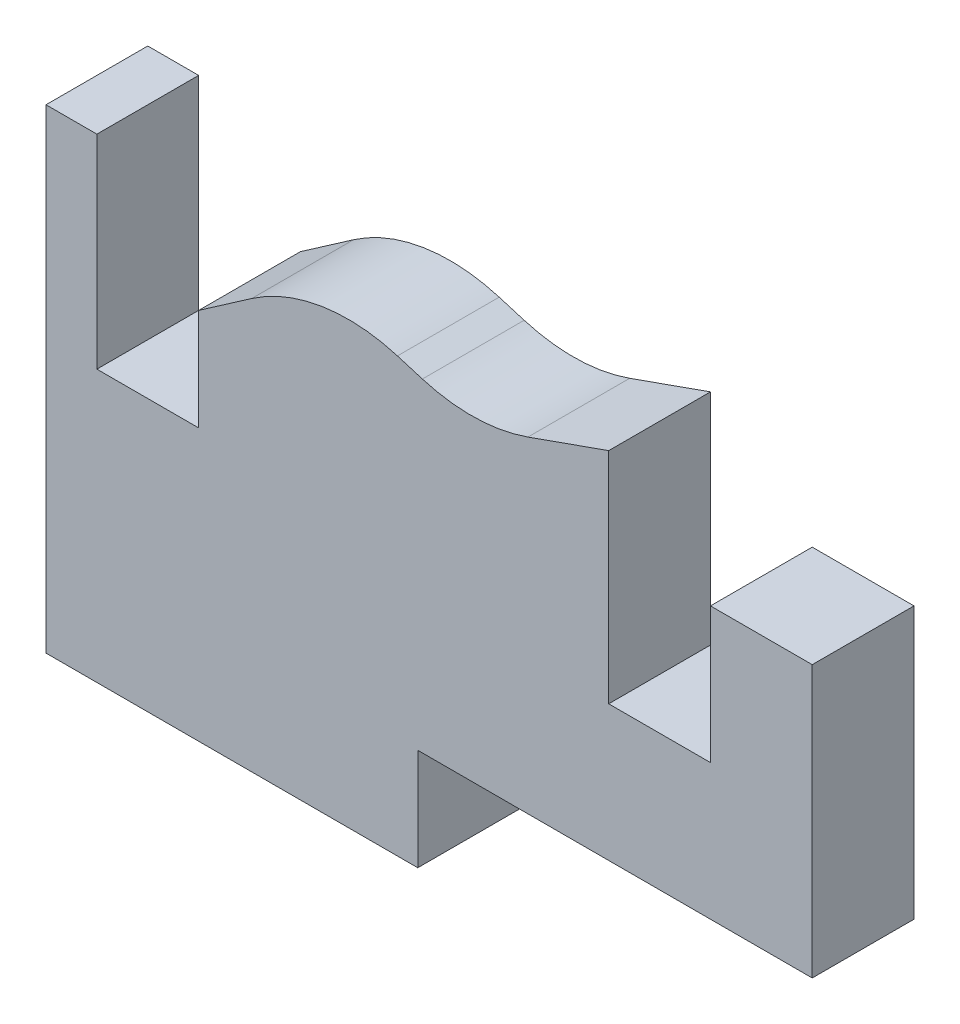
ISO-10303-21;
HEADER;
FILE_DESCRIPTION(('STEP AP214'),'2;1');
FILE_NAME('part.step','',(''),(''),'','','');
FILE_SCHEMA(('AUTOMOTIVE_DESIGN { 1 0 10303 214 1 1 1 1 }'));
ENDSEC;
DATA;
#1=APPLICATION_CONTEXT('core data for automotive mechanical design processes');
#2=APPLICATION_PROTOCOL_DEFINITION('international standard','automotive_design',2000,#1);
#3=PRODUCT_CONTEXT('',#1,'mechanical');
#4=PRODUCT('Part','Part','',(#3));
#5=PRODUCT_RELATED_PRODUCT_CATEGORY('part','',(#4));
#6=PRODUCT_DEFINITION_FORMATION('','',#4);
#7=PRODUCT_DEFINITION_CONTEXT('part definition',#1,'design');
#8=PRODUCT_DEFINITION('design','',#6,#7);
#9=PRODUCT_DEFINITION_SHAPE('','',#8);
#10=(LENGTH_UNIT() NAMED_UNIT(*) SI_UNIT(.MILLI.,.METRE.));
#11=(NAMED_UNIT(*) PLANE_ANGLE_UNIT() SI_UNIT($,.RADIAN.));
#12=(NAMED_UNIT(*) SI_UNIT($,.STERADIAN.) SOLID_ANGLE_UNIT());
#13=UNCERTAINTY_MEASURE_WITH_UNIT(LENGTH_MEASURE(1.E-05),#10,'distance_accuracy_value','');
#14=(GEOMETRIC_REPRESENTATION_CONTEXT(3) GLOBAL_UNCERTAINTY_ASSIGNED_CONTEXT((#13)) GLOBAL_UNIT_ASSIGNED_CONTEXT((#10,
#11,#12)) REPRESENTATION_CONTEXT('',''));
#15=CARTESIAN_POINT('',(0.,0.,0.));
#16=DIRECTION('',(0.,0.,1.));
#17=DIRECTION('',(1.,0.,0.));
#18=AXIS2_PLACEMENT_3D('',#15,#16,#17);
#19=CARTESIAN_POINT('',(-18.6877025722781,-9.27080407187214,6.));
#20=DIRECTION('',(1.,0.,0.));
#21=DIRECTION('',(0.,0.,-1.));
#22=AXIS2_PLACEMENT_3D('',#19,#20,#21);
#23=PLANE('',#22);
#24=DIRECTION('',(0.,-1.,0.));
#25=VECTOR('',#24,1.);
#26=CARTESIAN_POINT('',(-18.6877025722781,-9.27080407187214,0.));
#27=LINE('',#26,#25);
#28=CARTESIAN_POINT('',(-18.6877025722781,18.7291959281279,0.));
#29=VERTEX_POINT('',#28);
#30=CARTESIAN_POINT('',(-18.6877025722781,-9.27080407187214,0.));
#31=VERTEX_POINT('',#30);
#32=EDGE_CURVE('E191',#29,#31,#27,.T.);
#33=ORIENTED_EDGE('',*,*,#32,.T.);
#34=DIRECTION('',(0.,0.,-1.));
#35=VECTOR('',#34,1.);
#36=CARTESIAN_POINT('',(-18.6877025722781,-9.27080407187214,6.));
#37=LINE('',#36,#35);
#38=CARTESIAN_POINT('',(-18.6877025722781,-9.27080407187214,6.));
#39=VERTEX_POINT('',#38);
#40=EDGE_CURVE('E11',#39,#31,#37,.T.);
#41=ORIENTED_EDGE('',*,*,#40,.F.);
#42=DIRECTION('',(0.,-1.,0.));
#43=VECTOR('',#42,1.);
#44=CARTESIAN_POINT('',(-18.6877025722781,-9.27080407187214,6.));
#45=LINE('',#44,#43);
#46=CARTESIAN_POINT('',(-18.6877025722781,18.7291959281279,6.));
#47=VERTEX_POINT('',#46);
#48=EDGE_CURVE('E225',#47,#39,#45,.T.);
#49=ORIENTED_EDGE('',*,*,#48,.F.);
#50=DIRECTION('',(0.,0.,-1.));
#51=VECTOR('',#50,1.);
#52=CARTESIAN_POINT('',(-18.6877025722781,18.7291959281279,6.));
#53=LINE('',#52,#51);
#54=EDGE_CURVE('E187',#47,#29,#53,.T.);
#55=ORIENTED_EDGE('',*,*,#54,.T.);
#56=EDGE_LOOP('',(#33,#41,#49,#55));
#57=FACE_BOUND('',#56,.T.);
#58=ADVANCED_FACE('F35',(#57),#23,.F.);
#59=CARTESIAN_POINT('',(3.23123178772195,-9.27080407187214,6.));
#60=DIRECTION('',(0.,1.,0.));
#61=DIRECTION('',(-1.,0.,0.));
#62=AXIS2_PLACEMENT_3D('',#59,#60,#61);
#63=PLANE('',#62);
#64=DIRECTION('',(1.,0.,0.));
#65=VECTOR('',#64,1.);
#66=CARTESIAN_POINT('',(3.23123178772195,-9.27080407187214,0.));
#67=LINE('',#66,#65);
#68=CARTESIAN_POINT('',(3.23123178772195,-9.27080407187214,0.));
#69=VERTEX_POINT('',#68);
#70=EDGE_CURVE('E194',#31,#69,#67,.T.);
#71=ORIENTED_EDGE('',*,*,#70,.T.);
#72=DIRECTION('',(0.,0.,-1.));
#73=VECTOR('',#72,1.);
#74=CARTESIAN_POINT('',(3.23123178772195,-9.27080407187214,6.));
#75=LINE('',#74,#73);
#76=CARTESIAN_POINT('',(3.23123178772195,-9.27080407187214,6.));
#77=VERTEX_POINT('',#76);
#78=EDGE_CURVE('E43',#77,#69,#75,.T.);
#79=ORIENTED_EDGE('',*,*,#78,.F.);
#80=DIRECTION('',(1.,0.,0.));
#81=VECTOR('',#80,1.);
#82=CARTESIAN_POINT('',(3.23123178772195,-9.27080407187214,6.));
#83=LINE('',#82,#81);
#84=EDGE_CURVE('E124',#39,#77,#83,.T.);
#85=ORIENTED_EDGE('',*,*,#84,.F.);
#86=ORIENTED_EDGE('',*,*,#40,.T.);
#87=EDGE_LOOP('',(#71,#79,#85,#86));
#88=FACE_BOUND('',#87,.T.);
#89=ADVANCED_FACE('F333',(#88),#63,.F.);
#90=CARTESIAN_POINT('',(3.23123178772195,-3.27080407187214,6.));
#91=DIRECTION('',(-1.,0.,0.));
#92=DIRECTION('',(0.,-1.,0.));
#93=AXIS2_PLACEMENT_3D('',#90,#91,#92);
#94=PLANE('',#93);
#95=DIRECTION('',(0.,1.,0.));
#96=VECTOR('',#95,1.);
#97=CARTESIAN_POINT('',(3.23123178772195,-3.27080407187214,0.));
#98=LINE('',#97,#96);
#99=CARTESIAN_POINT('',(3.23123178772195,-3.27080407187214,0.));
#100=VERTEX_POINT('',#99);
#101=EDGE_CURVE('E196',#69,#100,#98,.T.);
#102=ORIENTED_EDGE('',*,*,#101,.T.);
#103=DIRECTION('',(0.,0.,-1.));
#104=VECTOR('',#103,1.);
#105=CARTESIAN_POINT('',(3.23123178772195,-3.27080407187214,6.));
#106=LINE('',#105,#104);
#107=CARTESIAN_POINT('',(3.23123178772195,-3.27080407187214,6.));
#108=VERTEX_POINT('',#107);
#109=EDGE_CURVE('E262',#108,#100,#106,.T.);
#110=ORIENTED_EDGE('',*,*,#109,.F.);
#111=DIRECTION('',(0.,1.,0.));
#112=VECTOR('',#111,1.);
#113=CARTESIAN_POINT('',(3.23123178772195,-3.27080407187214,6.));
#114=LINE('',#113,#112);
#115=EDGE_CURVE('E270',#77,#108,#114,.T.);
#116=ORIENTED_EDGE('',*,*,#115,.F.);
#117=ORIENTED_EDGE('',*,*,#78,.T.);
#118=EDGE_LOOP('',(#102,#110,#116,#117));
#119=FACE_BOUND('',#118,.T.);
#120=ADVANCED_FACE('F268',(#119),#94,.F.);
#121=CARTESIAN_POINT('',(26.4880277677219,-3.27080407187214,6.));
#122=DIRECTION('',(0.,1.,0.));
#123=DIRECTION('',(-1.,0.,0.));
#124=AXIS2_PLACEMENT_3D('',#121,#122,#123);
#125=PLANE('',#124);
#126=DIRECTION('',(1.,0.,0.));
#127=VECTOR('',#126,1.);
#128=CARTESIAN_POINT('',(26.4880277677219,-3.27080407187214,0.));
#129=LINE('',#128,#127);
#130=CARTESIAN_POINT('',(26.4880277677219,-3.27080407187214,0.));
#131=VERTEX_POINT('',#130);
#132=EDGE_CURVE('E198',#100,#131,#129,.T.);
#133=ORIENTED_EDGE('',*,*,#132,.T.);
#134=DIRECTION('',(0.,0.,-1.));
#135=VECTOR('',#134,1.);
#136=CARTESIAN_POINT('',(26.4880277677219,-3.27080407187214,6.));
#137=LINE('',#136,#135);
#138=CARTESIAN_POINT('',(26.4880277677219,-3.27080407187214,6.));
#139=VERTEX_POINT('',#138);
#140=EDGE_CURVE('E259',#139,#131,#137,.T.);
#141=ORIENTED_EDGE('',*,*,#140,.F.);
#142=DIRECTION('',(1.,0.,0.));
#143=VECTOR('',#142,1.);
#144=CARTESIAN_POINT('',(26.4880277677219,-3.27080407187214,6.));
#145=LINE('',#144,#143);
#146=EDGE_CURVE('E288',#108,#139,#145,.T.);
#147=ORIENTED_EDGE('',*,*,#146,.F.);
#148=ORIENTED_EDGE('',*,*,#109,.T.);
#149=EDGE_LOOP('',(#133,#141,#147,#148));
#150=FACE_BOUND('',#149,.T.);
#151=ADVANCED_FACE('F279',(#150),#125,.F.);
#152=CARTESIAN_POINT('',(26.4880277677219,12.7291959281279,6.));
#153=DIRECTION('',(-1.,0.,0.));
#154=DIRECTION('',(0.,0.,1.));
#155=AXIS2_PLACEMENT_3D('',#152,#153,#154);
#156=PLANE('',#155);
#157=DIRECTION('',(0.,1.,0.));
#158=VECTOR('',#157,1.);
#159=CARTESIAN_POINT('',(26.4880277677219,12.7291959281279,0.));
#160=LINE('',#159,#158);
#161=CARTESIAN_POINT('',(26.4880277677219,12.7291959281279,0.));
#162=VERTEX_POINT('',#161);
#163=EDGE_CURVE('E200',#131,#162,#160,.T.);
#164=ORIENTED_EDGE('',*,*,#163,.T.);
#165=DIRECTION('',(0.,0.,-1.));
#166=VECTOR('',#165,1.);
#167=CARTESIAN_POINT('',(26.4880277677219,12.7291959281279,6.));
#168=LINE('',#167,#166);
#169=CARTESIAN_POINT('',(26.4880277677219,12.7291959281279,6.));
#170=VERTEX_POINT('',#169);
#171=EDGE_CURVE('E256',#170,#162,#168,.T.);
#172=ORIENTED_EDGE('',*,*,#171,.F.);
#173=DIRECTION('',(0.,1.,0.));
#174=VECTOR('',#173,1.);
#175=CARTESIAN_POINT('',(26.4880277677219,12.7291959281279,6.));
#176=LINE('',#175,#174);
#177=EDGE_CURVE('E285',#139,#170,#176,.T.);
#178=ORIENTED_EDGE('',*,*,#177,.F.);
#179=ORIENTED_EDGE('',*,*,#140,.T.);
#180=EDGE_LOOP('',(#164,#172,#178,#179));
#181=FACE_BOUND('',#180,.T.);
#182=ADVANCED_FACE('F283',(#181),#156,.F.);
#183=CARTESIAN_POINT('',(20.4880277677219,12.7291959281279,6.));
#184=DIRECTION('',(0.,-1.,0.));
#185=DIRECTION('',(0.,0.,-1.));
#186=AXIS2_PLACEMENT_3D('',#183,#184,#185);
#187=PLANE('',#186);
#188=DIRECTION('',(-1.,0.,0.));
#189=VECTOR('',#188,1.);
#190=CARTESIAN_POINT('',(20.4880277677219,12.7291959281279,0.));
#191=LINE('',#190,#189);
#192=CARTESIAN_POINT('',(20.4880277677219,12.7291959281279,0.));
#193=VERTEX_POINT('',#192);
#194=EDGE_CURVE('E202',#162,#193,#191,.T.);
#195=ORIENTED_EDGE('',*,*,#194,.T.);
#196=DIRECTION('',(0.,0.,-1.));
#197=VECTOR('',#196,1.);
#198=CARTESIAN_POINT('',(20.4880277677219,12.7291959281279,6.));
#199=LINE('',#198,#197);
#200=CARTESIAN_POINT('',(20.4880277677219,12.7291959281279,6.));
#201=VERTEX_POINT('',#200);
#202=EDGE_CURVE('E253',#201,#193,#199,.T.);
#203=ORIENTED_EDGE('',*,*,#202,.F.);
#204=DIRECTION('',(-1.,0.,0.));
#205=VECTOR('',#204,1.);
#206=CARTESIAN_POINT('',(20.4880277677219,12.7291959281279,6.));
#207=LINE('',#206,#205);
#208=EDGE_CURVE('E287',#170,#201,#207,.T.);
#209=ORIENTED_EDGE('',*,*,#208,.F.);
#210=ORIENTED_EDGE('',*,*,#171,.T.);
#211=EDGE_LOOP('',(#195,#203,#209,#210));
#212=FACE_BOUND('',#211,.T.);
#213=ADVANCED_FACE('F346',(#212),#187,.F.);
#214=CARTESIAN_POINT('',(20.4880277677219,4.72919592812786,6.));
#215=DIRECTION('',(1.,0.,0.));
#216=DIRECTION('',(0.,0.,-1.));
#217=AXIS2_PLACEMENT_3D('',#214,#215,#216);
#218=PLANE('',#217);
#219=DIRECTION('',(0.,-1.,0.));
#220=VECTOR('',#219,1.);
#221=CARTESIAN_POINT('',(20.4880277677219,4.72919592812786,0.));
#222=LINE('',#221,#220);
#223=CARTESIAN_POINT('',(20.4880277677219,4.72919592812786,0.));
#224=VERTEX_POINT('',#223);
#225=EDGE_CURVE('E204',#193,#224,#222,.T.);
#226=ORIENTED_EDGE('',*,*,#225,.T.);
#227=DIRECTION('',(0.,0.,-1.));
#228=VECTOR('',#227,1.);
#229=CARTESIAN_POINT('',(20.4880277677219,4.72919592812786,6.));
#230=LINE('',#229,#228);
#231=CARTESIAN_POINT('',(20.4880277677219,4.72919592812786,6.));
#232=VERTEX_POINT('',#231);
#233=EDGE_CURVE('E250',#232,#224,#230,.T.);
#234=ORIENTED_EDGE('',*,*,#233,.F.);
#235=DIRECTION('',(0.,-1.,0.));
#236=VECTOR('',#235,1.);
#237=CARTESIAN_POINT('',(20.4880277677219,4.72919592812786,6.));
#238=LINE('',#237,#236);
#239=EDGE_CURVE('E290',#201,#232,#238,.T.);
#240=ORIENTED_EDGE('',*,*,#239,.F.);
#241=ORIENTED_EDGE('',*,*,#202,.T.);
#242=EDGE_LOOP('',(#226,#234,#240,#241));
#243=FACE_BOUND('',#242,.T.);
#244=ADVANCED_FACE('F349',(#243),#218,.F.);
#245=CARTESIAN_POINT('',(14.4880277677219,4.72919592812786,6.));
#246=DIRECTION('',(0.,-1.,0.));
#247=DIRECTION('',(1.,0.,0.));
#248=AXIS2_PLACEMENT_3D('',#245,#246,#247);
#249=PLANE('',#248);
#250=DIRECTION('',(-1.,0.,0.));
#251=VECTOR('',#250,1.);
#252=CARTESIAN_POINT('',(14.4880277677219,4.72919592812786,0.));
#253=LINE('',#252,#251);
#254=CARTESIAN_POINT('',(14.4880277677219,4.72919592812786,0.));
#255=VERTEX_POINT('',#254);
#256=EDGE_CURVE('E206',#224,#255,#253,.T.);
#257=ORIENTED_EDGE('',*,*,#256,.T.);
#258=DIRECTION('',(0.,0.,-1.));
#259=VECTOR('',#258,1.);
#260=CARTESIAN_POINT('',(14.4880277677219,4.72919592812786,6.));
#261=LINE('',#260,#259);
#262=CARTESIAN_POINT('',(14.4880277677219,4.72919592812786,6.));
#263=VERTEX_POINT('',#262);
#264=EDGE_CURVE('E247',#263,#255,#261,.T.);
#265=ORIENTED_EDGE('',*,*,#264,.F.);
#266=DIRECTION('',(-1.,0.,0.));
#267=VECTOR('',#266,1.);
#268=CARTESIAN_POINT('',(14.4880277677219,4.72919592812786,6.));
#269=LINE('',#268,#267);
#270=EDGE_CURVE('E296',#232,#263,#269,.T.);
#271=ORIENTED_EDGE('',*,*,#270,.F.);
#272=ORIENTED_EDGE('',*,*,#233,.T.);
#273=EDGE_LOOP('',(#257,#265,#271,#272));
#274=FACE_BOUND('',#273,.T.);
#275=ADVANCED_FACE('F353',(#274),#249,.F.);
#276=CARTESIAN_POINT('',(14.4880277677219,17.6569697492713,6.));
#277=DIRECTION('',(-1.,0.,0.));
#278=DIRECTION('',(0.,0.,1.));
#279=AXIS2_PLACEMENT_3D('',#276,#277,#278);
#280=PLANE('',#279);
#281=DIRECTION('',(0.,1.,0.));
#282=VECTOR('',#281,1.);
#283=CARTESIAN_POINT('',(14.4880277677219,17.6569697492713,0.));
#284=LINE('',#283,#282);
#285=CARTESIAN_POINT('',(14.4880277677219,17.6569697492713,0.));
#286=VERTEX_POINT('',#285);
#287=EDGE_CURVE('E208',#255,#286,#284,.T.);
#288=ORIENTED_EDGE('',*,*,#287,.T.);
#289=DIRECTION('',(0.,0.,-1.));
#290=VECTOR('',#289,1.);
#291=CARTESIAN_POINT('',(14.4880277677219,17.6569697492713,6.));
#292=LINE('',#291,#290);
#293=CARTESIAN_POINT('',(14.4880277677219,17.6569697492713,6.));
#294=VERTEX_POINT('',#293);
#295=EDGE_CURVE('E244',#294,#286,#292,.T.);
#296=ORIENTED_EDGE('',*,*,#295,.F.);
#297=DIRECTION('',(0.,1.,0.));
#298=VECTOR('',#297,1.);
#299=CARTESIAN_POINT('',(14.4880277677219,17.6569697492713,6.));
#300=LINE('',#299,#298);
#301=EDGE_CURVE('E298',#263,#294,#300,.T.);
#302=ORIENTED_EDGE('',*,*,#301,.F.);
#303=ORIENTED_EDGE('',*,*,#264,.T.);
#304=EDGE_LOOP('',(#288,#296,#302,#303));
#305=FACE_BOUND('',#304,.T.);
#306=ADVANCED_FACE('F357',(#305),#280,.F.);
#307=CARTESIAN_POINT('',(9.72694097862762,15.9703207980221,6.));
#308=DIRECTION('',(0.333922909877691,-0.942600387364028,0.));
#309=DIRECTION('',(0.942600387364028,0.333922909877691,0.));
#310=AXIS2_PLACEMENT_3D('',#307,#308,#309);
#311=PLANE('',#310);
#312=DIRECTION('',(-0.942600387364028,-0.333922909877691,0.));
#313=VECTOR('',#312,1.);
#314=CARTESIAN_POINT('',(9.72694097862762,15.9703207980221,0.));
#315=LINE('',#314,#313);
#316=CARTESIAN_POINT('',(9.72694097862761,15.9703207980221,0.));
#317=VERTEX_POINT('',#316);
#318=EDGE_CURVE('E210',#286,#317,#315,.T.);
#319=ORIENTED_EDGE('',*,*,#318,.T.);
#320=DIRECTION('',(0.,0.,-1.));
#321=VECTOR('',#320,1.);
#322=CARTESIAN_POINT('',(9.72694097862761,15.9703207980221,6.));
#323=LINE('',#322,#321);
#324=CARTESIAN_POINT('',(9.72694097862761,15.9703207980221,6.));
#325=VERTEX_POINT('',#324);
#326=EDGE_CURVE('E241',#325,#317,#323,.T.);
#327=ORIENTED_EDGE('',*,*,#326,.F.);
#328=DIRECTION('',(-0.942600387364028,-0.333922909877691,0.));
#329=VECTOR('',#328,1.);
#330=CARTESIAN_POINT('',(9.72694097862762,15.9703207980221,6.));
#331=LINE('',#330,#329);
#332=EDGE_CURVE('E300',#294,#325,#331,.T.);
#333=ORIENTED_EDGE('',*,*,#332,.F.);
#334=ORIENTED_EDGE('',*,*,#295,.T.);
#335=EDGE_LOOP('',(#319,#327,#333,#334));
#336=FACE_BOUND('',#335,.T.);
#337=ADVANCED_FACE('F361',(#336),#311,.F.);
#338=CARTESIAN_POINT('',(6.38771187985067,25.3963246716624,6.));
#339=DIRECTION('',(0.,0.,-1.));
#340=DIRECTION('',(-1.,0.,0.));
#341=AXIS2_PLACEMENT_3D('',#338,#339,#340);
#342=CYLINDRICAL_SURFACE('',#341,10.);
#343=CARTESIAN_POINT('',(6.38771187985067,25.3963246716624,0.));
#344=DIRECTION('',(0.,0.,-1.));
#345=DIRECTION('',(1.,0.,0.));
#346=AXIS2_PLACEMENT_3D('',#343,#344,#345);
#347=CIRCLE('',#346,10.);
#348=CARTESIAN_POINT('',(3.50365106899499,15.8212427796216,0.));
#349=VERTEX_POINT('',#348);
#350=EDGE_CURVE('E212',#317,#349,#347,.T.);
#351=ORIENTED_EDGE('',*,*,#350,.T.);
#352=DIRECTION('',(0.,0.,-1.));
#353=VECTOR('',#352,1.);
#354=CARTESIAN_POINT('',(3.50365106899499,15.8212427796216,6.));
#355=LINE('',#354,#353);
#356=CARTESIAN_POINT('',(3.50365106899499,15.8212427796216,6.));
#357=VERTEX_POINT('',#356);
#358=EDGE_CURVE('E238',#357,#349,#355,.T.);
#359=ORIENTED_EDGE('',*,*,#358,.F.);
#360=CARTESIAN_POINT('',(6.38771187985067,25.3963246716624,6.));
#361=DIRECTION('',(0.,0.,-1.));
#362=DIRECTION('',(1.,0.,0.));
#363=AXIS2_PLACEMENT_3D('',#360,#361,#362);
#364=CIRCLE('',#363,10.);
#365=EDGE_CURVE('E302',#325,#357,#364,.T.);
#366=ORIENTED_EDGE('',*,*,#365,.F.);
#367=ORIENTED_EDGE('',*,*,#326,.T.);
#368=EDGE_LOOP('',(#351,#359,#366,#367));
#369=FACE_BOUND('',#368,.T.);
#370=ADVANCED_FACE('F365',(#369),#342,.F.);
#371=CARTESIAN_POINT('',(2.03137850058164,16.2646983725172,6.));
#372=DIRECTION('',(-0.288406081085566,-0.957508189204075,0.));
#373=DIRECTION('',(0.957508189204075,-0.288406081085566,0.));
#374=AXIS2_PLACEMENT_3D('',#371,#372,#373);
#375=PLANE('',#374);
#376=DIRECTION('',(-0.957508189204075,0.288406081085566,0.));
#377=VECTOR('',#376,1.);
#378=CARTESIAN_POINT('',(2.03137850058164,16.2646983725172,0.));
#379=LINE('',#378,#377);
#380=CARTESIAN_POINT('',(2.03137850058164,16.2646983725172,0.));
#381=VERTEX_POINT('',#380);
#382=EDGE_CURVE('E214',#349,#381,#379,.T.);
#383=ORIENTED_EDGE('',*,*,#382,.T.);
#384=DIRECTION('',(0.,0.,-1.));
#385=VECTOR('',#384,1.);
#386=CARTESIAN_POINT('',(2.03137850058164,16.2646983725172,6.));
#387=LINE('',#386,#385);
#388=CARTESIAN_POINT('',(2.03137850058164,16.2646983725172,6.));
#389=VERTEX_POINT('',#388);
#390=EDGE_CURVE('E235',#389,#381,#387,.T.);
#391=ORIENTED_EDGE('',*,*,#390,.F.);
#392=DIRECTION('',(-0.957508189204075,0.288406081085566,0.));
#393=VECTOR('',#392,1.);
#394=CARTESIAN_POINT('',(2.03137850058164,16.2646983725172,6.));
#395=LINE('',#394,#393);
#396=EDGE_CURVE('E304',#357,#389,#395,.T.);
#397=ORIENTED_EDGE('',*,*,#396,.F.);
#398=ORIENTED_EDGE('',*,*,#358,.T.);
#399=EDGE_LOOP('',(#383,#391,#397,#398));
#400=FACE_BOUND('',#399,.T.);
#401=ADVANCED_FACE('F369',(#400),#375,.F.);
#402=CARTESIAN_POINT('',(-0.852682310274052,6.68961648047649,6.));
#403=DIRECTION('',(0.,0.,-1.));
#404=DIRECTION('',(-1.,0.,0.));
#405=AXIS2_PLACEMENT_3D('',#402,#403,#404);
#406=CYLINDRICAL_SURFACE('',#405,10.);
#407=CARTESIAN_POINT('',(-0.852682310274052,6.68961648047649,0.));
#408=DIRECTION('',(0.,0.,1.));
#409=DIRECTION('',(-1.,0.,0.));
#410=AXIS2_PLACEMENT_3D('',#407,#408,#409);
#411=CIRCLE('',#410,10.);
#412=CARTESIAN_POINT('',(-6.55623597884777,14.9035969741044,0.));
#413=VERTEX_POINT('',#412);
#414=EDGE_CURVE('E216',#381,#413,#411,.T.);
#415=ORIENTED_EDGE('',*,*,#414,.T.);
#416=DIRECTION('',(0.,0.,-1.));
#417=VECTOR('',#416,1.);
#418=CARTESIAN_POINT('',(-6.55623597884777,14.9035969741044,6.));
#419=LINE('',#418,#417);
#420=CARTESIAN_POINT('',(-6.55623597884777,14.9035969741044,6.));
#421=VERTEX_POINT('',#420);
#422=EDGE_CURVE('E232',#421,#413,#419,.T.);
#423=ORIENTED_EDGE('',*,*,#422,.F.);
#424=CARTESIAN_POINT('',(-0.852682310274052,6.68961648047649,6.));
#425=DIRECTION('',(0.,0.,1.));
#426=DIRECTION('',(-1.,0.,0.));
#427=AXIS2_PLACEMENT_3D('',#424,#425,#426);
#428=CIRCLE('',#427,10.);
#429=EDGE_CURVE('E306',#389,#421,#428,.T.);
#430=ORIENTED_EDGE('',*,*,#429,.F.);
#431=ORIENTED_EDGE('',*,*,#390,.T.);
#432=EDGE_LOOP('',(#415,#423,#430,#431));
#433=FACE_BOUND('',#432,.T.);
#434=ADVANCED_FACE('F373',(#433),#406,.T.);
#435=CARTESIAN_POINT('',(-9.68770257227805,12.7291959281279,6.));
#436=DIRECTION('',(0.570355366857368,-0.82139804936279,0.));
#437=DIRECTION('',(0.82139804936279,0.570355366857368,0.));
#438=AXIS2_PLACEMENT_3D('',#435,#436,#437);
#439=PLANE('',#438);
#440=DIRECTION('',(-0.82139804936279,-0.570355366857368,0.));
#441=VECTOR('',#440,1.);
#442=CARTESIAN_POINT('',(-9.68770257227805,12.7291959281279,0.));
#443=LINE('',#442,#441);
#444=CARTESIAN_POINT('',(-9.68770257227805,12.7291959281279,0.));
#445=VERTEX_POINT('',#444);
#446=EDGE_CURVE('E218',#413,#445,#443,.T.);
#447=ORIENTED_EDGE('',*,*,#446,.T.);
#448=DIRECTION('',(0.,0.,-1.));
#449=VECTOR('',#448,1.);
#450=CARTESIAN_POINT('',(-9.68770257227805,12.7291959281279,6.));
#451=LINE('',#450,#449);
#452=CARTESIAN_POINT('',(-9.68770257227805,12.7291959281279,6.));
#453=VERTEX_POINT('',#452);
#454=EDGE_CURVE('E229',#453,#445,#451,.T.);
#455=ORIENTED_EDGE('',*,*,#454,.F.);
#456=DIRECTION('',(-0.82139804936279,-0.570355366857368,0.));
#457=VECTOR('',#456,1.);
#458=CARTESIAN_POINT('',(-9.68770257227805,12.7291959281279,6.));
#459=LINE('',#458,#457);
#460=EDGE_CURVE('E308',#421,#453,#459,.T.);
#461=ORIENTED_EDGE('',*,*,#460,.F.);
#462=ORIENTED_EDGE('',*,*,#422,.T.);
#463=EDGE_LOOP('',(#447,#455,#461,#462));
#464=FACE_BOUND('',#463,.T.);
#465=ADVANCED_FACE('F314',(#464),#439,.F.);
#466=CARTESIAN_POINT('',(-9.68770257227805,6.72919592812786,6.));
#467=DIRECTION('',(1.,0.,0.));
#468=DIRECTION('',(0.,0.,-1.));
#469=AXIS2_PLACEMENT_3D('',#466,#467,#468);
#470=PLANE('',#469);
#471=DIRECTION('',(0.,-1.,0.));
#472=VECTOR('',#471,1.);
#473=CARTESIAN_POINT('',(-9.68770257227805,6.72919592812786,0.));
#474=LINE('',#473,#472);
#475=CARTESIAN_POINT('',(-9.68770257227805,6.72919592812786,0.));
#476=VERTEX_POINT('',#475);
#477=EDGE_CURVE('E220',#445,#476,#474,.T.);
#478=ORIENTED_EDGE('',*,*,#477,.T.);
#479=DIRECTION('',(0.,0.,-1.));
#480=VECTOR('',#479,1.);
#481=CARTESIAN_POINT('',(-9.68770257227805,6.72919592812786,6.));
#482=LINE('',#481,#480);
#483=CARTESIAN_POINT('',(-9.68770257227805,6.72919592812786,6.));
#484=VERTEX_POINT('',#483);
#485=EDGE_CURVE('E182',#484,#476,#482,.T.);
#486=ORIENTED_EDGE('',*,*,#485,.F.);
#487=DIRECTION('',(0.,-1.,0.));
#488=VECTOR('',#487,1.);
#489=CARTESIAN_POINT('',(-9.68770257227805,6.72919592812786,6.));
#490=LINE('',#489,#488);
#491=EDGE_CURVE('E173',#453,#484,#490,.T.);
#492=ORIENTED_EDGE('',*,*,#491,.F.);
#493=ORIENTED_EDGE('',*,*,#454,.T.);
#494=EDGE_LOOP('',(#478,#486,#492,#493));
#495=FACE_BOUND('',#494,.T.);
#496=ADVANCED_FACE('F318',(#495),#470,.F.);
#497=CARTESIAN_POINT('',(-15.6877025722781,6.72919592812786,6.));
#498=DIRECTION('',(0.,-1.,0.));
#499=DIRECTION('',(0.,0.,-1.));
#500=AXIS2_PLACEMENT_3D('',#497,#498,#499);
#501=PLANE('',#500);
#502=DIRECTION('',(-1.,0.,0.));
#503=VECTOR('',#502,1.);
#504=CARTESIAN_POINT('',(-15.6877025722781,6.72919592812786,0.));
#505=LINE('',#504,#503);
#506=CARTESIAN_POINT('',(-15.6877025722781,6.72919592812786,0.));
#507=VERTEX_POINT('',#506);
#508=EDGE_CURVE('E181',#476,#507,#505,.T.);
#509=ORIENTED_EDGE('',*,*,#508,.T.);
#510=DIRECTION('',(0.,0.,-1.));
#511=VECTOR('',#510,1.);
#512=CARTESIAN_POINT('',(-15.6877025722781,6.72919592812786,6.));
#513=LINE('',#512,#511);
#514=CARTESIAN_POINT('',(-15.6877025722781,6.72919592812786,6.));
#515=VERTEX_POINT('',#514);
#516=EDGE_CURVE('E178',#515,#507,#513,.T.);
#517=ORIENTED_EDGE('',*,*,#516,.F.);
#518=DIRECTION('',(-1.,0.,0.));
#519=VECTOR('',#518,1.);
#520=CARTESIAN_POINT('',(-15.6877025722781,6.72919592812786,6.));
#521=LINE('',#520,#519);
#522=EDGE_CURVE('E167',#484,#515,#521,.T.);
#523=ORIENTED_EDGE('',*,*,#522,.F.);
#524=ORIENTED_EDGE('',*,*,#485,.T.);
#525=EDGE_LOOP('',(#509,#517,#523,#524));
#526=FACE_BOUND('',#525,.T.);
#527=ADVANCED_FACE('F179',(#526),#501,.F.);
#528=CARTESIAN_POINT('',(-15.6877025722781,18.7291959281279,6.));
#529=DIRECTION('',(-1.,0.,0.));
#530=DIRECTION('',(0.,0.,1.));
#531=AXIS2_PLACEMENT_3D('',#528,#529,#530);
#532=PLANE('',#531);
#533=DIRECTION('',(0.,1.,0.));
#534=VECTOR('',#533,1.);
#535=CARTESIAN_POINT('',(-15.6877025722781,18.7291959281279,0.));
#536=LINE('',#535,#534);
#537=CARTESIAN_POINT('',(-15.6877025722781,18.7291959281279,0.));
#538=VERTEX_POINT('',#537);
#539=EDGE_CURVE('E110',#507,#538,#536,.T.);
#540=ORIENTED_EDGE('',*,*,#539,.T.);
#541=DIRECTION('',(0.,0.,-1.));
#542=VECTOR('',#541,1.);
#543=CARTESIAN_POINT('',(-15.6877025722781,18.7291959281279,6.));
#544=LINE('',#543,#542);
#545=CARTESIAN_POINT('',(-15.6877025722781,18.7291959281279,6.));
#546=VERTEX_POINT('',#545);
#547=EDGE_CURVE('E183',#546,#538,#544,.T.);
#548=ORIENTED_EDGE('',*,*,#547,.F.);
#549=DIRECTION('',(0.,1.,0.));
#550=VECTOR('',#549,1.);
#551=CARTESIAN_POINT('',(-15.6877025722781,18.7291959281279,6.));
#552=LINE('',#551,#550);
#553=EDGE_CURVE('E171',#515,#546,#552,.T.);
#554=ORIENTED_EDGE('',*,*,#553,.F.);
#555=ORIENTED_EDGE('',*,*,#516,.T.);
#556=EDGE_LOOP('',(#540,#548,#554,#555));
#557=FACE_BOUND('',#556,.T.);
#558=ADVANCED_FACE('F185',(#557),#532,.F.);
#559=CARTESIAN_POINT('',(-18.6877025722781,18.7291959281279,6.));
#560=DIRECTION('',(0.,-1.,0.));
#561=DIRECTION('',(0.,0.,-1.));
#562=AXIS2_PLACEMENT_3D('',#559,#560,#561);
#563=PLANE('',#562);
#564=DIRECTION('',(-1.,0.,0.));
#565=VECTOR('',#564,1.);
#566=CARTESIAN_POINT('',(-18.6877025722781,18.7291959281279,0.));
#567=LINE('',#566,#565);
#568=EDGE_CURVE('E116',#538,#29,#567,.T.);
#569=ORIENTED_EDGE('',*,*,#568,.T.);
#570=ORIENTED_EDGE('',*,*,#54,.F.);
#571=DIRECTION('',(-1.,0.,0.));
#572=VECTOR('',#571,1.);
#573=CARTESIAN_POINT('',(-18.6877025722781,18.7291959281279,6.));
#574=LINE('',#573,#572);
#575=EDGE_CURVE('E51',#546,#47,#574,.T.);
#576=ORIENTED_EDGE('',*,*,#575,.F.);
#577=ORIENTED_EDGE('',*,*,#547,.T.);
#578=EDGE_LOOP('',(#569,#570,#576,#577));
#579=FACE_BOUND('',#578,.T.);
#580=ADVANCED_FACE('F322',(#579),#563,.F.);
#581=CARTESIAN_POINT('',(-0.852682310274052,6.68961648047649,6.));
#582=DIRECTION('',(0.,0.,-1.));
#583=DIRECTION('',(-1.,0.,0.));
#584=AXIS2_PLACEMENT_3D('',#581,#582,#583);
#585=PLANE('',#584);
#586=ORIENTED_EDGE('',*,*,#48,.T.);
#587=ORIENTED_EDGE('',*,*,#84,.T.);
#588=ORIENTED_EDGE('',*,*,#115,.T.);
#589=ORIENTED_EDGE('',*,*,#146,.T.);
#590=ORIENTED_EDGE('',*,*,#177,.T.);
#591=ORIENTED_EDGE('',*,*,#208,.T.);
#592=ORIENTED_EDGE('',*,*,#239,.T.);
#593=ORIENTED_EDGE('',*,*,#270,.T.);
#594=ORIENTED_EDGE('',*,*,#301,.T.);
#595=ORIENTED_EDGE('',*,*,#332,.T.);
#596=ORIENTED_EDGE('',*,*,#365,.T.);
#597=ORIENTED_EDGE('',*,*,#396,.T.);
#598=ORIENTED_EDGE('',*,*,#429,.T.);
#599=ORIENTED_EDGE('',*,*,#460,.T.);
#600=ORIENTED_EDGE('',*,*,#491,.T.);
#601=ORIENTED_EDGE('',*,*,#522,.T.);
#602=ORIENTED_EDGE('',*,*,#553,.T.);
#603=ORIENTED_EDGE('',*,*,#575,.T.);
#604=EDGE_LOOP('',(#586,#587,#588,#589,#590,#591,#592,#593,#594,#595,#596,#597,#598,#599,#600,
#601,#602,#603));
#605=FACE_BOUND('',#604,.T.);
#606=ADVANCED_FACE('F169',(#605),#585,.F.);
#607=CARTESIAN_POINT('',(-0.852682310274052,6.68961648047649,0.));
#608=DIRECTION('',(0.,0.,-1.));
#609=DIRECTION('',(-1.,0.,0.));
#610=AXIS2_PLACEMENT_3D('',#607,#608,#609);
#611=PLANE('',#610);
#612=ORIENTED_EDGE('',*,*,#32,.F.);
#613=ORIENTED_EDGE('',*,*,#568,.F.);
#614=ORIENTED_EDGE('',*,*,#539,.F.);
#615=ORIENTED_EDGE('',*,*,#508,.F.);
#616=ORIENTED_EDGE('',*,*,#477,.F.);
#617=ORIENTED_EDGE('',*,*,#446,.F.);
#618=ORIENTED_EDGE('',*,*,#414,.F.);
#619=ORIENTED_EDGE('',*,*,#382,.F.);
#620=ORIENTED_EDGE('',*,*,#350,.F.);
#621=ORIENTED_EDGE('',*,*,#318,.F.);
#622=ORIENTED_EDGE('',*,*,#287,.F.);
#623=ORIENTED_EDGE('',*,*,#256,.F.);
#624=ORIENTED_EDGE('',*,*,#225,.F.);
#625=ORIENTED_EDGE('',*,*,#194,.F.);
#626=ORIENTED_EDGE('',*,*,#163,.F.);
#627=ORIENTED_EDGE('',*,*,#132,.F.);
#628=ORIENTED_EDGE('',*,*,#101,.F.);
#629=ORIENTED_EDGE('',*,*,#70,.F.);
#630=EDGE_LOOP('',(#612,#613,#614,#615,#616,#617,#618,#619,#620,#621,#622,#623,#624,#625,#626,
#627,#628,#629));
#631=FACE_BOUND('',#630,.T.);
#632=ADVANCED_FACE('F274',(#631),#611,.T.);
#633=CLOSED_SHELL('',(#58,#89,#120,#151,#182,#213,#244,#275,#306,#337,#370,#401,#434,#465,#496,
#527,#558,#580,#606,#632));
#634=MANIFOLD_SOLID_BREP('B2',#633);
#635=ADVANCED_BREP_SHAPE_REPRESENTATION('',(#18,#634),#14);
#636=SHAPE_DEFINITION_REPRESENTATION(#9,#635);
ENDSEC;
END-ISO-10303-21;
